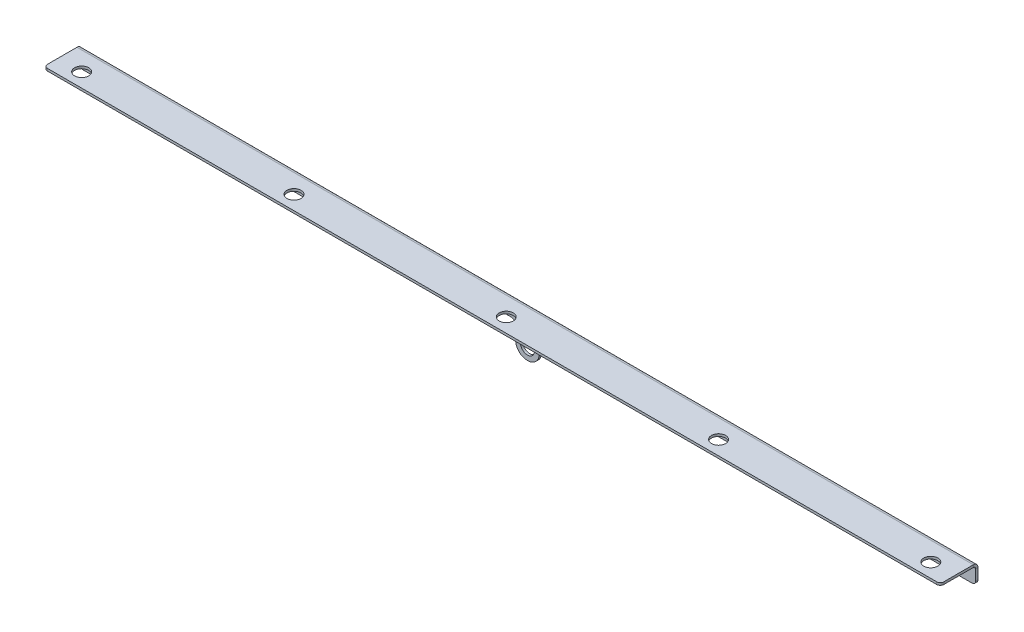
ISO-10303-21;
HEADER;
FILE_DESCRIPTION(('STEP AP214'),'2;1');
FILE_NAME('part.step','',(''),(''),'','','');
FILE_SCHEMA(('AUTOMOTIVE_DESIGN { 1 0 10303 214 1 1 1 1 }'));
ENDSEC;
DATA;
#1=APPLICATION_CONTEXT('core data for automotive mechanical design processes');
#2=APPLICATION_PROTOCOL_DEFINITION('international standard','automotive_design',2000,#1);
#3=PRODUCT_CONTEXT('',#1,'mechanical');
#4=PRODUCT('Part','Part','',(#3));
#5=PRODUCT_RELATED_PRODUCT_CATEGORY('part','',(#4));
#6=PRODUCT_DEFINITION_FORMATION('','',#4);
#7=PRODUCT_DEFINITION_CONTEXT('part definition',#1,'design');
#8=PRODUCT_DEFINITION('design','',#6,#7);
#9=PRODUCT_DEFINITION_SHAPE('','',#8);
#10=(LENGTH_UNIT() NAMED_UNIT(*) SI_UNIT(.MILLI.,.METRE.));
#11=(NAMED_UNIT(*) PLANE_ANGLE_UNIT() SI_UNIT($,.RADIAN.));
#12=(NAMED_UNIT(*) SI_UNIT($,.STERADIAN.) SOLID_ANGLE_UNIT());
#13=UNCERTAINTY_MEASURE_WITH_UNIT(LENGTH_MEASURE(1.E-05),#10,'distance_accuracy_value','');
#14=(GEOMETRIC_REPRESENTATION_CONTEXT(3) GLOBAL_UNCERTAINTY_ASSIGNED_CONTEXT((#13)) GLOBAL_UNIT_ASSIGNED_CONTEXT((#10,
#11,#12)) REPRESENTATION_CONTEXT('',''));
#15=CARTESIAN_POINT('',(0.,0.,0.));
#16=DIRECTION('',(0.,0.,1.));
#17=DIRECTION('',(1.,0.,0.));
#18=AXIS2_PLACEMENT_3D('',#15,#16,#17);
#19=CARTESIAN_POINT('',(378.5,7.00000000000004,14.5));
#20=DIRECTION('',(0.,-1.,0.));
#21=DIRECTION('',(0.,0.,-1.));
#22=AXIS2_PLACEMENT_3D('',#19,#20,#21);
#23=CYLINDRICAL_SURFACE('',#22,1.5);
#24=DIRECTION('',(0.,-1.,0.));
#25=VECTOR('',#24,1.);
#26=CARTESIAN_POINT('',(380.,7.00000000000002,14.5));
#27=LINE('',#26,#25);
#28=CARTESIAN_POINT('',(380.,8.00000000000005,14.5));
#29=VERTEX_POINT('',#28);
#30=CARTESIAN_POINT('',(380.,7.00000000000002,14.5));
#31=VERTEX_POINT('',#30);
#32=EDGE_CURVE('E11',#29,#31,#27,.T.);
#33=ORIENTED_EDGE('',*,*,#32,.F.);
#34=CARTESIAN_POINT('',(378.5,8.00000000000004,14.5));
#35=DIRECTION('',(0.,-1.,0.));
#36=DIRECTION('',(0.,0.,-1.));
#37=AXIS2_PLACEMENT_3D('',#34,#35,#36);
#38=CIRCLE('',#37,1.5);
#39=CARTESIAN_POINT('',(378.5,8.00000000000006,16.));
#40=VERTEX_POINT('',#39);
#41=EDGE_CURVE('E157',#40,#29,#38,.F.);
#42=ORIENTED_EDGE('',*,*,#41,.F.);
#43=DIRECTION('',(0.,-1.,0.));
#44=VECTOR('',#43,1.);
#45=CARTESIAN_POINT('',(378.5,7.00000000000005,16.));
#46=LINE('',#45,#44);
#47=CARTESIAN_POINT('',(378.5,7.00000000000005,16.));
#48=VERTEX_POINT('',#47);
#49=EDGE_CURVE('E46',#40,#48,#46,.T.);
#50=ORIENTED_EDGE('',*,*,#49,.T.);
#51=CARTESIAN_POINT('',(378.5,7.00000000000004,14.5));
#52=DIRECTION('',(0.,-1.,0.));
#53=DIRECTION('',(0.,0.,-1.));
#54=AXIS2_PLACEMENT_3D('',#51,#52,#53);
#55=CIRCLE('',#54,1.5);
#56=EDGE_CURVE('E282',#48,#31,#55,.F.);
#57=ORIENTED_EDGE('',*,*,#56,.T.);
#58=EDGE_LOOP('',(#33,#42,#50,#57));
#59=FACE_BOUND('',#58,.T.);
#60=ADVANCED_FACE('F36',(#59),#23,.T.);
#61=CARTESIAN_POINT('',(380.,7.00000000000005,16.));
#62=DIRECTION('',(0.,0.,-1.));
#63=DIRECTION('',(1.,0.,0.));
#64=AXIS2_PLACEMENT_3D('',#61,#62,#63);
#65=PLANE('',#64);
#66=ORIENTED_EDGE('',*,*,#49,.F.);
#67=DIRECTION('',(1.,0.,0.));
#68=VECTOR('',#67,1.);
#69=CARTESIAN_POINT('',(0.,8.00000000000006,16.));
#70=LINE('',#69,#68);
#71=CARTESIAN_POINT('',(1.5,8.00000000000006,16.));
#72=VERTEX_POINT('',#71);
#73=EDGE_CURVE('E212',#40,#72,#70,.F.);
#74=ORIENTED_EDGE('',*,*,#73,.T.);
#75=DIRECTION('',(0.,-1.,0.));
#76=VECTOR('',#75,1.);
#77=CARTESIAN_POINT('',(1.5,7.00000000000005,16.));
#78=LINE('',#77,#76);
#79=CARTESIAN_POINT('',(1.5,7.00000000000005,16.));
#80=VERTEX_POINT('',#79);
#81=EDGE_CURVE('E275',#72,#80,#78,.T.);
#82=ORIENTED_EDGE('',*,*,#81,.T.);
#83=DIRECTION('',(1.,0.,0.));
#84=VECTOR('',#83,1.);
#85=CARTESIAN_POINT('',(380.,7.00000000000005,16.));
#86=LINE('',#85,#84);
#87=EDGE_CURVE('E292',#48,#80,#86,.F.);
#88=ORIENTED_EDGE('',*,*,#87,.F.);
#89=EDGE_LOOP('',(#66,#74,#82,#88));
#90=FACE_BOUND('',#89,.T.);
#91=ADVANCED_FACE('F295',(#90),#65,.F.);
#92=CARTESIAN_POINT('',(1.5,7.00000000000005,14.5));
#93=DIRECTION('',(0.,-1.,0.));
#94=DIRECTION('',(0.,0.,-1.));
#95=AXIS2_PLACEMENT_3D('',#92,#93,#94);
#96=CYLINDRICAL_SURFACE('',#95,1.5);
#97=ORIENTED_EDGE('',*,*,#81,.F.);
#98=CARTESIAN_POINT('',(1.5,8.00000000000005,14.5));
#99=DIRECTION('',(0.,-1.,0.));
#100=DIRECTION('',(0.,0.,-1.));
#101=AXIS2_PLACEMENT_3D('',#98,#99,#100);
#102=CIRCLE('',#101,1.5);
#103=CARTESIAN_POINT('',(0.,8.00000000000005,14.5));
#104=VERTEX_POINT('',#103);
#105=EDGE_CURVE('E209',#104,#72,#102,.F.);
#106=ORIENTED_EDGE('',*,*,#105,.F.);
#107=DIRECTION('',(0.,-1.,0.));
#108=VECTOR('',#107,1.);
#109=CARTESIAN_POINT('',(0.,7.00000000000005,14.5));
#110=LINE('',#109,#108);
#111=CARTESIAN_POINT('',(0.,7.00000000000005,14.5));
#112=VERTEX_POINT('',#111);
#113=EDGE_CURVE('E272',#104,#112,#110,.T.);
#114=ORIENTED_EDGE('',*,*,#113,.T.);
#115=CARTESIAN_POINT('',(1.5,7.00000000000005,14.5));
#116=DIRECTION('',(0.,-1.,0.));
#117=DIRECTION('',(0.,0.,-1.));
#118=AXIS2_PLACEMENT_3D('',#115,#116,#117);
#119=CIRCLE('',#118,1.5);
#120=EDGE_CURVE('E296',#112,#80,#119,.F.);
#121=ORIENTED_EDGE('',*,*,#120,.T.);
#122=EDGE_LOOP('',(#97,#106,#114,#121));
#123=FACE_BOUND('',#122,.T.);
#124=ADVANCED_FACE('F488',(#123),#96,.T.);
#125=CARTESIAN_POINT('',(0.,7.00000000000005,16.));
#126=DIRECTION('',(-1.,0.,0.));
#127=DIRECTION('',(0.,0.,-1.));
#128=AXIS2_PLACEMENT_3D('',#125,#126,#127);
#129=PLANE('',#128);
#130=ORIENTED_EDGE('',*,*,#113,.F.);
#131=DIRECTION('',(0.,0.,-1.));
#132=VECTOR('',#131,1.);
#133=CARTESIAN_POINT('',(0.,8.,0.));
#134=LINE('',#133,#132);
#135=CARTESIAN_POINT('',(0.,8.00000000000001,2.));
#136=VERTEX_POINT('',#135);
#137=EDGE_CURVE('E153',#104,#136,#134,.T.);
#138=ORIENTED_EDGE('',*,*,#137,.T.);
#139=DIRECTION('',(0.,-1.,0.));
#140=VECTOR('',#139,1.);
#141=CARTESIAN_POINT('',(0.,7.00000000000002,2.));
#142=LINE('',#141,#140);
#143=CARTESIAN_POINT('',(0.,7.00000000000002,2.));
#144=VERTEX_POINT('',#143);
#145=EDGE_CURVE('E269',#136,#144,#142,.T.);
#146=ORIENTED_EDGE('',*,*,#145,.T.);
#147=DIRECTION('',(0.,0.,-1.));
#148=VECTOR('',#147,1.);
#149=CARTESIAN_POINT('',(0.,7.00000000000005,16.));
#150=LINE('',#149,#148);
#151=EDGE_CURVE('E431',#112,#144,#150,.T.);
#152=ORIENTED_EDGE('',*,*,#151,.F.);
#153=EDGE_LOOP('',(#130,#138,#146,#152));
#154=FACE_BOUND('',#153,.T.);
#155=ADVANCED_FACE('F430',(#154),#129,.T.);
#156=CARTESIAN_POINT('',(0.,6.,2.));
#157=DIRECTION('',(1.,0.,0.));
#158=DIRECTION('',(0.,0.,-1.));
#159=AXIS2_PLACEMENT_3D('',#156,#157,#158);
#160=PLANE('',#159);
#161=ORIENTED_EDGE('',*,*,#145,.F.);
#162=CARTESIAN_POINT('',(0.,6.,2.));
#163=DIRECTION('',(-1.,0.,0.));
#164=DIRECTION('',(0.,0.,1.));
#165=AXIS2_PLACEMENT_3D('',#162,#163,#164);
#166=CIRCLE('',#165,2.);
#167=CARTESIAN_POINT('',(0.,6.,0.));
#168=VERTEX_POINT('',#167);
#169=EDGE_CURVE('E149',#136,#168,#166,.T.);
#170=ORIENTED_EDGE('',*,*,#169,.T.);
#171=DIRECTION('',(0.,0.,1.));
#172=VECTOR('',#171,1.);
#173=CARTESIAN_POINT('',(0.,6.,1.));
#174=LINE('',#173,#172);
#175=CARTESIAN_POINT('',(0.,6.,1.));
#176=VERTEX_POINT('',#175);
#177=EDGE_CURVE('E266',#168,#176,#174,.T.);
#178=ORIENTED_EDGE('',*,*,#177,.T.);
#179=CARTESIAN_POINT('',(0.,6.,2.));
#180=DIRECTION('',(-1.,0.,0.));
#181=DIRECTION('',(0.,0.,1.));
#182=AXIS2_PLACEMENT_3D('',#179,#180,#181);
#183=CIRCLE('',#182,1.);
#184=EDGE_CURVE('E138',#144,#176,#183,.T.);
#185=ORIENTED_EDGE('',*,*,#184,.F.);
#186=EDGE_LOOP('',(#161,#170,#178,#185));
#187=FACE_BOUND('',#186,.T.);
#188=ADVANCED_FACE('F427',(#187),#160,.F.);
#189=CARTESIAN_POINT('',(0.,0.,1.));
#190=DIRECTION('',(-1.,0.,0.));
#191=DIRECTION('',(0.,1.,0.));
#192=AXIS2_PLACEMENT_3D('',#189,#190,#191);
#193=PLANE('',#192);
#194=ORIENTED_EDGE('',*,*,#177,.F.);
#195=DIRECTION('',(0.,1.,0.));
#196=VECTOR('',#195,1.);
#197=CARTESIAN_POINT('',(0.,0.,0.));
#198=LINE('',#197,#196);
#199=CARTESIAN_POINT('',(0.,1.5,0.));
#200=VERTEX_POINT('',#199);
#201=EDGE_CURVE('E204',#168,#200,#198,.F.);
#202=ORIENTED_EDGE('',*,*,#201,.T.);
#203=DIRECTION('',(0.,0.,1.));
#204=VECTOR('',#203,1.);
#205=CARTESIAN_POINT('',(0.,1.5,1.));
#206=LINE('',#205,#204);
#207=CARTESIAN_POINT('',(0.,1.5,1.));
#208=VERTEX_POINT('',#207);
#209=EDGE_CURVE('E263',#200,#208,#206,.T.);
#210=ORIENTED_EDGE('',*,*,#209,.T.);
#211=DIRECTION('',(0.,1.,0.));
#212=VECTOR('',#211,1.);
#213=CARTESIAN_POINT('',(0.,0.,1.));
#214=LINE('',#213,#212);
#215=EDGE_CURVE('E325',#176,#208,#214,.F.);
#216=ORIENTED_EDGE('',*,*,#215,.F.);
#217=EDGE_LOOP('',(#194,#202,#210,#216));
#218=FACE_BOUND('',#217,.T.);
#219=ADVANCED_FACE('F554',(#218),#193,.T.);
#220=CARTESIAN_POINT('',(1.5,1.5,1.));
#221=DIRECTION('',(0.,0.,1.));
#222=DIRECTION('',(1.,0.,0.));
#223=AXIS2_PLACEMENT_3D('',#220,#221,#222);
#224=CYLINDRICAL_SURFACE('',#223,1.5);
#225=ORIENTED_EDGE('',*,*,#209,.F.);
#226=CARTESIAN_POINT('',(1.5,1.5,0.));
#227=DIRECTION('',(0.,0.,1.));
#228=DIRECTION('',(1.,0.,0.));
#229=AXIS2_PLACEMENT_3D('',#226,#227,#228);
#230=CIRCLE('',#229,1.5);
#231=CARTESIAN_POINT('',(1.5,0.,0.));
#232=VERTEX_POINT('',#231);
#233=EDGE_CURVE('E201',#232,#200,#230,.F.);
#234=ORIENTED_EDGE('',*,*,#233,.F.);
#235=DIRECTION('',(0.,0.,1.));
#236=VECTOR('',#235,1.);
#237=CARTESIAN_POINT('',(1.5,0.,1.));
#238=LINE('',#237,#236);
#239=CARTESIAN_POINT('',(1.5,0.,1.));
#240=VERTEX_POINT('',#239);
#241=EDGE_CURVE('E260',#232,#240,#238,.T.);
#242=ORIENTED_EDGE('',*,*,#241,.T.);
#243=CARTESIAN_POINT('',(1.5,1.5,1.));
#244=DIRECTION('',(0.,0.,1.));
#245=DIRECTION('',(1.,0.,0.));
#246=AXIS2_PLACEMENT_3D('',#243,#244,#245);
#247=CIRCLE('',#246,1.5);
#248=EDGE_CURVE('E328',#240,#208,#247,.F.);
#249=ORIENTED_EDGE('',*,*,#248,.T.);
#250=EDGE_LOOP('',(#225,#234,#242,#249));
#251=FACE_BOUND('',#250,.T.);
#252=ADVANCED_FACE('F550',(#251),#224,.T.);
#253=CARTESIAN_POINT('',(0.,0.,1.));
#254=DIRECTION('',(0.,1.,0.));
#255=DIRECTION('',(1.,0.,0.));
#256=AXIS2_PLACEMENT_3D('',#253,#254,#255);
#257=PLANE('',#256);
#258=ORIENTED_EDGE('',*,*,#241,.F.);
#259=DIRECTION('',(-1.,0.,0.));
#260=VECTOR('',#259,1.);
#261=CARTESIAN_POINT('',(0.,0.,0.));
#262=LINE('',#261,#260);
#263=CARTESIAN_POINT('',(183.,0.,0.));
#264=VERTEX_POINT('',#263);
#265=EDGE_CURVE('E198',#232,#264,#262,.F.);
#266=ORIENTED_EDGE('',*,*,#265,.T.);
#267=DIRECTION('',(0.,0.,1.));
#268=VECTOR('',#267,1.);
#269=CARTESIAN_POINT('',(183.,0.,1.));
#270=LINE('',#269,#268);
#271=CARTESIAN_POINT('',(183.,0.,1.));
#272=VERTEX_POINT('',#271);
#273=EDGE_CURVE('E257',#264,#272,#270,.T.);
#274=ORIENTED_EDGE('',*,*,#273,.T.);
#275=DIRECTION('',(1.,0.,0.));
#276=VECTOR('',#275,1.);
#277=CARTESIAN_POINT('',(0.,0.,1.));
#278=LINE('',#277,#276);
#279=EDGE_CURVE('E331',#240,#272,#278,.T.);
#280=ORIENTED_EDGE('',*,*,#279,.F.);
#281=EDGE_LOOP('',(#258,#266,#274,#280));
#282=FACE_BOUND('',#281,.T.);
#283=ADVANCED_FACE('F546',(#282),#257,.F.);
#284=CARTESIAN_POINT('',(183.,-2.,1.));
#285=DIRECTION('',(0.,0.,1.));
#286=DIRECTION('',(1.,0.,0.));
#287=AXIS2_PLACEMENT_3D('',#284,#285,#286);
#288=CYLINDRICAL_SURFACE('',#287,2.);
#289=ORIENTED_EDGE('',*,*,#273,.F.);
#290=CARTESIAN_POINT('',(183.,-2.,0.));
#291=DIRECTION('',(0.,0.,1.));
#292=DIRECTION('',(1.,0.,0.));
#293=AXIS2_PLACEMENT_3D('',#290,#291,#292);
#294=CIRCLE('',#293,2.);
#295=CARTESIAN_POINT('',(185.,-2.,0.));
#296=VERTEX_POINT('',#295);
#297=EDGE_CURVE('E195',#264,#296,#294,.F.);
#298=ORIENTED_EDGE('',*,*,#297,.T.);
#299=DIRECTION('',(0.,0.,1.));
#300=VECTOR('',#299,1.);
#301=CARTESIAN_POINT('',(185.,-2.,1.));
#302=LINE('',#301,#300);
#303=CARTESIAN_POINT('',(185.,-2.,1.));
#304=VERTEX_POINT('',#303);
#305=EDGE_CURVE('E254',#296,#304,#302,.T.);
#306=ORIENTED_EDGE('',*,*,#305,.T.);
#307=CARTESIAN_POINT('',(183.,-2.,1.));
#308=DIRECTION('',(0.,0.,1.));
#309=DIRECTION('',(1.,0.,0.));
#310=AXIS2_PLACEMENT_3D('',#307,#308,#309);
#311=CIRCLE('',#310,2.);
#312=EDGE_CURVE('E334',#272,#304,#311,.F.);
#313=ORIENTED_EDGE('',*,*,#312,.F.);
#314=EDGE_LOOP('',(#289,#298,#306,#313));
#315=FACE_BOUND('',#314,.T.);
#316=ADVANCED_FACE('F543',(#315),#288,.F.);
#317=CARTESIAN_POINT('',(185.,-12.5,1.));
#318=DIRECTION('',(-1.,0.,0.));
#319=DIRECTION('',(0.,1.,0.));
#320=AXIS2_PLACEMENT_3D('',#317,#318,#319);
#321=PLANE('',#320);
#322=ORIENTED_EDGE('',*,*,#305,.F.);
#323=DIRECTION('',(0.,1.,0.));
#324=VECTOR('',#323,1.);
#325=CARTESIAN_POINT('',(185.,0.,0.));
#326=LINE('',#325,#324);
#327=CARTESIAN_POINT('',(185.,-7.6,0.));
#328=VERTEX_POINT('',#327);
#329=EDGE_CURVE('E192',#296,#328,#326,.F.);
#330=ORIENTED_EDGE('',*,*,#329,.T.);
#331=DIRECTION('',(0.,0.,1.));
#332=VECTOR('',#331,1.);
#333=CARTESIAN_POINT('',(185.,-7.6,1.));
#334=LINE('',#333,#332);
#335=CARTESIAN_POINT('',(185.,-7.6,1.));
#336=VERTEX_POINT('',#335);
#337=EDGE_CURVE('E251',#328,#336,#334,.T.);
#338=ORIENTED_EDGE('',*,*,#337,.T.);
#339=DIRECTION('',(0.,1.,0.));
#340=VECTOR('',#339,1.);
#341=CARTESIAN_POINT('',(185.,-12.5,1.));
#342=LINE('',#341,#340);
#343=EDGE_CURVE('E337',#304,#336,#342,.F.);
#344=ORIENTED_EDGE('',*,*,#343,.F.);
#345=EDGE_LOOP('',(#322,#330,#338,#344));
#346=FACE_BOUND('',#345,.T.);
#347=ADVANCED_FACE('F393',(#346),#321,.T.);
#348=CARTESIAN_POINT('',(189.9,-7.6,1.));
#349=DIRECTION('',(0.,0.,1.));
#350=DIRECTION('',(1.,0.,0.));
#351=AXIS2_PLACEMENT_3D('',#348,#349,#350);
#352=CYLINDRICAL_SURFACE('',#351,4.89999999999999);
#353=ORIENTED_EDGE('',*,*,#337,.F.);
#354=CARTESIAN_POINT('',(189.9,-7.6,0.));
#355=DIRECTION('',(0.,0.,1.));
#356=DIRECTION('',(1.,0.,0.));
#357=AXIS2_PLACEMENT_3D('',#354,#355,#356);
#358=CIRCLE('',#357,4.89999999999999);
#359=CARTESIAN_POINT('',(189.9,-12.5,0.));
#360=VERTEX_POINT('',#359);
#361=EDGE_CURVE('E167',#360,#328,#358,.F.);
#362=ORIENTED_EDGE('',*,*,#361,.F.);
#363=DIRECTION('',(0.,0.,1.));
#364=VECTOR('',#363,1.);
#365=CARTESIAN_POINT('',(189.9,-12.5,1.));
#366=LINE('',#365,#364);
#367=CARTESIAN_POINT('',(189.9,-12.5,1.));
#368=VERTEX_POINT('',#367);
#369=EDGE_CURVE('E249',#360,#368,#366,.T.);
#370=ORIENTED_EDGE('',*,*,#369,.T.);
#371=CARTESIAN_POINT('',(189.9,-7.6,1.));
#372=DIRECTION('',(0.,0.,1.));
#373=DIRECTION('',(1.,0.,0.));
#374=AXIS2_PLACEMENT_3D('',#371,#372,#373);
#375=CIRCLE('',#374,4.89999999999999);
#376=EDGE_CURVE('E340',#368,#336,#375,.F.);
#377=ORIENTED_EDGE('',*,*,#376,.T.);
#378=EDGE_LOOP('',(#353,#362,#370,#377));
#379=FACE_BOUND('',#378,.T.);
#380=ADVANCED_FACE('F399',(#379),#352,.T.);
#381=CARTESIAN_POINT('',(0.,-12.5,1.));
#382=DIRECTION('',(0.,1.,0.));
#383=DIRECTION('',(1.,0.,0.));
#384=AXIS2_PLACEMENT_3D('',#381,#382,#383);
#385=PLANE('',#384);
#386=ORIENTED_EDGE('',*,*,#369,.F.);
#387=DIRECTION('',(-1.,0.,0.));
#388=VECTOR('',#387,1.);
#389=CARTESIAN_POINT('',(0.,-12.5,0.));
#390=LINE('',#389,#388);
#391=CARTESIAN_POINT('',(190.1,-12.5,0.));
#392=VERTEX_POINT('',#391);
#393=EDGE_CURVE('E162',#392,#360,#390,.T.);
#394=ORIENTED_EDGE('',*,*,#393,.F.);
#395=DIRECTION('',(0.,0.,1.));
#396=VECTOR('',#395,1.);
#397=CARTESIAN_POINT('',(190.1,-12.5,1.));
#398=LINE('',#397,#396);
#399=CARTESIAN_POINT('',(190.1,-12.5,1.));
#400=VERTEX_POINT('',#399);
#401=EDGE_CURVE('E54',#392,#400,#398,.T.);
#402=ORIENTED_EDGE('',*,*,#401,.T.);
#403=DIRECTION('',(1.,0.,0.));
#404=VECTOR('',#403,1.);
#405=CARTESIAN_POINT('',(0.,-12.5,1.));
#406=LINE('',#405,#404);
#407=EDGE_CURVE('E343',#400,#368,#406,.F.);
#408=ORIENTED_EDGE('',*,*,#407,.T.);
#409=EDGE_LOOP('',(#386,#394,#402,#408));
#410=FACE_BOUND('',#409,.T.);
#411=ADVANCED_FACE('F400',(#410),#385,.F.);
#412=CARTESIAN_POINT('',(190.1,-7.6,1.));
#413=DIRECTION('',(0.,0.,-1.));
#414=DIRECTION('',(-1.,0.,0.));
#415=AXIS2_PLACEMENT_3D('',#412,#413,#414);
#416=CYLINDRICAL_SURFACE('',#415,4.89999999999999);
#417=ORIENTED_EDGE('',*,*,#401,.F.);
#418=CARTESIAN_POINT('',(190.1,-7.6,0.));
#419=DIRECTION('',(0.,0.,-1.));
#420=DIRECTION('',(-1.,0.,0.));
#421=AXIS2_PLACEMENT_3D('',#418,#419,#420);
#422=CIRCLE('',#421,4.89999999999999);
#423=CARTESIAN_POINT('',(195.,-7.6,0.));
#424=VERTEX_POINT('',#423);
#425=EDGE_CURVE('E186',#424,#392,#422,.T.);
#426=ORIENTED_EDGE('',*,*,#425,.F.);
#427=DIRECTION('',(0.,0.,1.));
#428=VECTOR('',#427,1.);
#429=CARTESIAN_POINT('',(195.,-7.6,1.));
#430=LINE('',#429,#428);
#431=CARTESIAN_POINT('',(195.,-7.6,1.));
#432=VERTEX_POINT('',#431);
#433=EDGE_CURVE('E245',#424,#432,#430,.T.);
#434=ORIENTED_EDGE('',*,*,#433,.T.);
#435=CARTESIAN_POINT('',(190.1,-7.6,1.));
#436=DIRECTION('',(0.,0.,-1.));
#437=DIRECTION('',(-1.,0.,0.));
#438=AXIS2_PLACEMENT_3D('',#435,#436,#437);
#439=CIRCLE('',#438,4.89999999999999);
#440=EDGE_CURVE('E304',#432,#400,#439,.T.);
#441=ORIENTED_EDGE('',*,*,#440,.T.);
#442=EDGE_LOOP('',(#417,#426,#434,#441));
#443=FACE_BOUND('',#442,.T.);
#444=ADVANCED_FACE('F407',(#443),#416,.T.);
#445=CARTESIAN_POINT('',(195.,-12.5,1.));
#446=DIRECTION('',(-1.,0.,0.));
#447=DIRECTION('',(0.,1.,0.));
#448=AXIS2_PLACEMENT_3D('',#445,#446,#447);
#449=PLANE('',#448);
#450=ORIENTED_EDGE('',*,*,#433,.F.);
#451=DIRECTION('',(0.,1.,0.));
#452=VECTOR('',#451,1.);
#453=CARTESIAN_POINT('',(195.,0.,0.));
#454=LINE('',#453,#452);
#455=CARTESIAN_POINT('',(195.,-2.,0.));
#456=VERTEX_POINT('',#455);
#457=EDGE_CURVE('E183',#424,#456,#454,.T.);
#458=ORIENTED_EDGE('',*,*,#457,.T.);
#459=DIRECTION('',(0.,0.,1.));
#460=VECTOR('',#459,1.);
#461=CARTESIAN_POINT('',(195.,-2.,1.));
#462=LINE('',#461,#460);
#463=CARTESIAN_POINT('',(195.,-2.,1.));
#464=VERTEX_POINT('',#463);
#465=EDGE_CURVE('E242',#456,#464,#462,.T.);
#466=ORIENTED_EDGE('',*,*,#465,.T.);
#467=DIRECTION('',(0.,1.,0.));
#468=VECTOR('',#467,1.);
#469=CARTESIAN_POINT('',(195.,-12.5,1.));
#470=LINE('',#469,#468);
#471=EDGE_CURVE('E307',#432,#464,#470,.T.);
#472=ORIENTED_EDGE('',*,*,#471,.F.);
#473=EDGE_LOOP('',(#450,#458,#466,#472));
#474=FACE_BOUND('',#473,.T.);
#475=ADVANCED_FACE('F411',(#474),#449,.F.);
#476=CARTESIAN_POINT('',(197.,-2.,1.));
#477=DIRECTION('',(0.,0.,-1.));
#478=DIRECTION('',(-1.,0.,0.));
#479=AXIS2_PLACEMENT_3D('',#476,#477,#478);
#480=CYLINDRICAL_SURFACE('',#479,2.);
#481=ORIENTED_EDGE('',*,*,#465,.F.);
#482=CARTESIAN_POINT('',(197.,-2.,0.));
#483=DIRECTION('',(0.,0.,-1.));
#484=DIRECTION('',(-1.,0.,0.));
#485=AXIS2_PLACEMENT_3D('',#482,#483,#484);
#486=CIRCLE('',#485,2.);
#487=CARTESIAN_POINT('',(197.,0.,0.));
#488=VERTEX_POINT('',#487);
#489=EDGE_CURVE('E180',#456,#488,#486,.T.);
#490=ORIENTED_EDGE('',*,*,#489,.T.);
#491=DIRECTION('',(0.,0.,1.));
#492=VECTOR('',#491,1.);
#493=CARTESIAN_POINT('',(197.,0.,1.));
#494=LINE('',#493,#492);
#495=CARTESIAN_POINT('',(197.,0.,1.));
#496=VERTEX_POINT('',#495);
#497=EDGE_CURVE('E239',#488,#496,#494,.T.);
#498=ORIENTED_EDGE('',*,*,#497,.T.);
#499=CARTESIAN_POINT('',(197.,-2.,1.));
#500=DIRECTION('',(0.,0.,-1.));
#501=DIRECTION('',(-1.,0.,0.));
#502=AXIS2_PLACEMENT_3D('',#499,#500,#501);
#503=CIRCLE('',#502,2.);
#504=EDGE_CURVE('E310',#464,#496,#503,.T.);
#505=ORIENTED_EDGE('',*,*,#504,.F.);
#506=EDGE_LOOP('',(#481,#490,#498,#505));
#507=FACE_BOUND('',#506,.T.);
#508=ADVANCED_FACE('F413',(#507),#480,.F.);
#509=CARTESIAN_POINT('',(0.,0.,1.));
#510=DIRECTION('',(0.,1.,0.));
#511=DIRECTION('',(1.,0.,0.));
#512=AXIS2_PLACEMENT_3D('',#509,#510,#511);
#513=PLANE('',#512);
#514=ORIENTED_EDGE('',*,*,#497,.F.);
#515=DIRECTION('',(-1.,0.,0.));
#516=VECTOR('',#515,1.);
#517=CARTESIAN_POINT('',(0.,0.,0.));
#518=LINE('',#517,#516);
#519=CARTESIAN_POINT('',(378.5,0.,0.));
#520=VERTEX_POINT('',#519);
#521=EDGE_CURVE('E177',#488,#520,#518,.F.);
#522=ORIENTED_EDGE('',*,*,#521,.T.);
#523=DIRECTION('',(0.,0.,1.));
#524=VECTOR('',#523,1.);
#525=CARTESIAN_POINT('',(378.5,0.,1.));
#526=LINE('',#525,#524);
#527=CARTESIAN_POINT('',(378.5,0.,1.));
#528=VERTEX_POINT('',#527);
#529=EDGE_CURVE('E236',#520,#528,#526,.T.);
#530=ORIENTED_EDGE('',*,*,#529,.T.);
#531=DIRECTION('',(1.,0.,0.));
#532=VECTOR('',#531,1.);
#533=CARTESIAN_POINT('',(0.,0.,1.));
#534=LINE('',#533,#532);
#535=EDGE_CURVE('E313',#496,#528,#534,.T.);
#536=ORIENTED_EDGE('',*,*,#535,.F.);
#537=EDGE_LOOP('',(#514,#522,#530,#536));
#538=FACE_BOUND('',#537,.T.);
#539=ADVANCED_FACE('F418',(#538),#513,.F.);
#540=CARTESIAN_POINT('',(378.5,1.5,1.));
#541=DIRECTION('',(0.,0.,1.));
#542=DIRECTION('',(1.,0.,0.));
#543=AXIS2_PLACEMENT_3D('',#540,#541,#542);
#544=CYLINDRICAL_SURFACE('',#543,1.5);
#545=ORIENTED_EDGE('',*,*,#529,.F.);
#546=CARTESIAN_POINT('',(378.5,1.5,0.));
#547=DIRECTION('',(0.,0.,1.));
#548=DIRECTION('',(1.,0.,0.));
#549=AXIS2_PLACEMENT_3D('',#546,#547,#548);
#550=CIRCLE('',#549,1.5);
#551=CARTESIAN_POINT('',(380.,1.5,0.));
#552=VERTEX_POINT('',#551);
#553=EDGE_CURVE('E174',#552,#520,#550,.F.);
#554=ORIENTED_EDGE('',*,*,#553,.F.);
#555=DIRECTION('',(0.,0.,1.));
#556=VECTOR('',#555,1.);
#557=CARTESIAN_POINT('',(380.,1.5,1.));
#558=LINE('',#557,#556);
#559=CARTESIAN_POINT('',(380.,1.5,1.));
#560=VERTEX_POINT('',#559);
#561=EDGE_CURVE('E233',#552,#560,#558,.T.);
#562=ORIENTED_EDGE('',*,*,#561,.T.);
#563=CARTESIAN_POINT('',(378.5,1.5,1.));
#564=DIRECTION('',(0.,0.,1.));
#565=DIRECTION('',(1.,0.,0.));
#566=AXIS2_PLACEMENT_3D('',#563,#564,#565);
#567=CIRCLE('',#566,1.5);
#568=EDGE_CURVE('E316',#560,#528,#567,.F.);
#569=ORIENTED_EDGE('',*,*,#568,.T.);
#570=EDGE_LOOP('',(#545,#554,#562,#569));
#571=FACE_BOUND('',#570,.T.);
#572=ADVANCED_FACE('F421',(#571),#544,.T.);
#573=CARTESIAN_POINT('',(380.,0.,1.));
#574=DIRECTION('',(-1.,0.,0.));
#575=DIRECTION('',(0.,1.,0.));
#576=AXIS2_PLACEMENT_3D('',#573,#574,#575);
#577=PLANE('',#576);
#578=ORIENTED_EDGE('',*,*,#561,.F.);
#579=DIRECTION('',(0.,1.,0.));
#580=VECTOR('',#579,1.);
#581=CARTESIAN_POINT('',(380.,0.,0.));
#582=LINE('',#581,#580);
#583=CARTESIAN_POINT('',(380.,6.,0.));
#584=VERTEX_POINT('',#583);
#585=EDGE_CURVE('E172',#552,#584,#582,.T.);
#586=ORIENTED_EDGE('',*,*,#585,.T.);
#587=DIRECTION('',(0.,0.,1.));
#588=VECTOR('',#587,1.);
#589=CARTESIAN_POINT('',(380.,6.,1.));
#590=LINE('',#589,#588);
#591=CARTESIAN_POINT('',(380.,6.,1.));
#592=VERTEX_POINT('',#591);
#593=EDGE_CURVE('E137',#584,#592,#590,.T.);
#594=ORIENTED_EDGE('',*,*,#593,.T.);
#595=DIRECTION('',(0.,1.,0.));
#596=VECTOR('',#595,1.);
#597=CARTESIAN_POINT('',(380.,0.,1.));
#598=LINE('',#597,#596);
#599=EDGE_CURVE('E319',#560,#592,#598,.T.);
#600=ORIENTED_EDGE('',*,*,#599,.F.);
#601=EDGE_LOOP('',(#578,#586,#594,#600));
#602=FACE_BOUND('',#601,.T.);
#603=ADVANCED_FACE('F422',(#602),#577,.F.);
#604=CARTESIAN_POINT('',(380.,6.,2.));
#605=DIRECTION('',(1.,0.,0.));
#606=DIRECTION('',(0.,0.,-1.));
#607=AXIS2_PLACEMENT_3D('',#604,#605,#606);
#608=PLANE('',#607);
#609=ORIENTED_EDGE('',*,*,#593,.F.);
#610=CARTESIAN_POINT('',(380.,6.,2.));
#611=DIRECTION('',(-1.,0.,0.));
#612=DIRECTION('',(0.,0.,1.));
#613=AXIS2_PLACEMENT_3D('',#610,#611,#612);
#614=CIRCLE('',#613,2.);
#615=CARTESIAN_POINT('',(380.,8.00000000000001,1.99999999999999));
#616=VERTEX_POINT('',#615);
#617=EDGE_CURVE('E146',#616,#584,#614,.T.);
#618=ORIENTED_EDGE('',*,*,#617,.F.);
#619=DIRECTION('',(0.,-1.,0.));
#620=VECTOR('',#619,1.);
#621=CARTESIAN_POINT('',(380.,7.,1.99999999999999));
#622=LINE('',#621,#620);
#623=CARTESIAN_POINT('',(380.,7.,1.99999999999999));
#624=VERTEX_POINT('',#623);
#625=EDGE_CURVE('E40',#616,#624,#622,.T.);
#626=ORIENTED_EDGE('',*,*,#625,.T.);
#627=CARTESIAN_POINT('',(380.,6.,2.));
#628=DIRECTION('',(-1.,0.,0.));
#629=DIRECTION('',(0.,0.,1.));
#630=AXIS2_PLACEMENT_3D('',#627,#628,#629);
#631=CIRCLE('',#630,1.);
#632=EDGE_CURVE('E345',#624,#592,#631,.T.);
#633=ORIENTED_EDGE('',*,*,#632,.T.);
#634=EDGE_LOOP('',(#609,#618,#626,#633));
#635=FACE_BOUND('',#634,.T.);
#636=ADVANCED_FACE('F159',(#635),#608,.T.);
#637=CARTESIAN_POINT('',(190.,7.00000000000003,10.));
#638=DIRECTION('',(0.,1.,0.));
#639=DIRECTION('',(0.,0.,1.));
#640=AXIS2_PLACEMENT_3D('',#637,#638,#639);
#641=CYLINDRICAL_SURFACE('',#640,2.99999999999999);
#642=CARTESIAN_POINT('',(190.,7.00000000000003,10.));
#643=DIRECTION('',(0.,1.,0.));
#644=DIRECTION('',(0.,0.,1.));
#645=AXIS2_PLACEMENT_3D('',#642,#643,#644);
#646=CIRCLE('',#645,2.99999999999999);
#647=CARTESIAN_POINT('',(190.,7.00000000000004,13.));
#648=VERTEX_POINT('',#647);
#649=EDGE_CURVE('E164',#648,#648,#646,.T.);
#650=ORIENTED_EDGE('',*,*,#649,.F.);
#651=EDGE_LOOP('',(#650));
#652=FACE_BOUND('',#651,.T.);
#653=CARTESIAN_POINT('',(190.,8.00000000000003,10.));
#654=DIRECTION('',(0.,1.,0.));
#655=DIRECTION('',(0.,0.,1.));
#656=AXIS2_PLACEMENT_3D('',#653,#654,#655);
#657=CIRCLE('',#656,2.99999999999999);
#658=CARTESIAN_POINT('',(190.,8.00000000000004,13.));
#659=VERTEX_POINT('',#658);
#660=EDGE_CURVE('E218',#659,#659,#657,.T.);
#661=ORIENTED_EDGE('',*,*,#660,.T.);
#662=EDGE_LOOP('',(#661));
#663=FACE_BOUND('',#662,.T.);
#664=ADVANCED_FACE('F452',(#652,#663),#641,.F.);
#665=CARTESIAN_POINT('',(10.,7.00000000000003,10.));
#666=DIRECTION('',(0.,1.,0.));
#667=DIRECTION('',(0.,0.,1.));
#668=AXIS2_PLACEMENT_3D('',#665,#666,#667);
#669=CYLINDRICAL_SURFACE('',#668,3.);
#670=CARTESIAN_POINT('',(10.,7.00000000000003,10.));
#671=DIRECTION('',(0.,1.,0.));
#672=DIRECTION('',(0.,0.,1.));
#673=AXIS2_PLACEMENT_3D('',#670,#671,#672);
#674=CIRCLE('',#673,3.);
#675=CARTESIAN_POINT('',(10.,7.00000000000004,13.));
#676=VERTEX_POINT('',#675);
#677=EDGE_CURVE('E444',#676,#676,#674,.T.);
#678=ORIENTED_EDGE('',*,*,#677,.F.);
#679=EDGE_LOOP('',(#678));
#680=FACE_BOUND('',#679,.T.);
#681=CARTESIAN_POINT('',(10.,8.00000000000003,10.));
#682=DIRECTION('',(0.,1.,0.));
#683=DIRECTION('',(0.,0.,1.));
#684=AXIS2_PLACEMENT_3D('',#681,#682,#683);
#685=CIRCLE('',#684,3.);
#686=CARTESIAN_POINT('',(10.,8.00000000000004,13.));
#687=VERTEX_POINT('',#686);
#688=EDGE_CURVE('E221',#687,#687,#685,.T.);
#689=ORIENTED_EDGE('',*,*,#688,.T.);
#690=EDGE_LOOP('',(#689));
#691=FACE_BOUND('',#690,.T.);
#692=ADVANCED_FACE('F455',(#680,#691),#669,.F.);
#693=CARTESIAN_POINT('',(100.,7.00000000000003,10.));
#694=DIRECTION('',(0.,1.,0.));
#695=DIRECTION('',(0.,0.,1.));
#696=AXIS2_PLACEMENT_3D('',#693,#694,#695);
#697=CYLINDRICAL_SURFACE('',#696,3.00000000000001);
#698=CARTESIAN_POINT('',(100.,7.00000000000003,10.));
#699=DIRECTION('',(0.,1.,0.));
#700=DIRECTION('',(0.,0.,1.));
#701=AXIS2_PLACEMENT_3D('',#698,#699,#700);
#702=CIRCLE('',#701,3.00000000000001);
#703=CARTESIAN_POINT('',(100.,7.00000000000004,13.));
#704=VERTEX_POINT('',#703);
#705=EDGE_CURVE('E441',#704,#704,#702,.T.);
#706=ORIENTED_EDGE('',*,*,#705,.F.);
#707=EDGE_LOOP('',(#706));
#708=FACE_BOUND('',#707,.T.);
#709=CARTESIAN_POINT('',(100.,8.00000000000003,10.));
#710=DIRECTION('',(0.,1.,0.));
#711=DIRECTION('',(0.,0.,1.));
#712=AXIS2_PLACEMENT_3D('',#709,#710,#711);
#713=CIRCLE('',#712,3.00000000000001);
#714=CARTESIAN_POINT('',(100.,8.00000000000004,13.));
#715=VERTEX_POINT('',#714);
#716=EDGE_CURVE('E224',#715,#715,#713,.T.);
#717=ORIENTED_EDGE('',*,*,#716,.T.);
#718=EDGE_LOOP('',(#717));
#719=FACE_BOUND('',#718,.T.);
#720=ADVANCED_FACE('F480',(#708,#719),#697,.F.);
#721=CARTESIAN_POINT('',(280.,7.00000000000003,10.));
#722=DIRECTION('',(0.,1.,0.));
#723=DIRECTION('',(0.,0.,1.));
#724=AXIS2_PLACEMENT_3D('',#721,#722,#723);
#725=CYLINDRICAL_SURFACE('',#724,3.00000000000005);
#726=CARTESIAN_POINT('',(280.,7.00000000000003,10.));
#727=DIRECTION('',(0.,1.,0.));
#728=DIRECTION('',(0.,0.,1.));
#729=AXIS2_PLACEMENT_3D('',#726,#727,#728);
#730=CIRCLE('',#729,3.00000000000005);
#731=CARTESIAN_POINT('',(280.,7.00000000000004,13.));
#732=VERTEX_POINT('',#731);
#733=EDGE_CURVE('E436',#732,#732,#730,.T.);
#734=ORIENTED_EDGE('',*,*,#733,.F.);
#735=EDGE_LOOP('',(#734));
#736=FACE_BOUND('',#735,.T.);
#737=CARTESIAN_POINT('',(280.,8.00000000000003,10.));
#738=DIRECTION('',(0.,1.,0.));
#739=DIRECTION('',(0.,0.,1.));
#740=AXIS2_PLACEMENT_3D('',#737,#738,#739);
#741=CIRCLE('',#740,3.00000000000005);
#742=CARTESIAN_POINT('',(280.,8.00000000000004,13.));
#743=VERTEX_POINT('',#742);
#744=EDGE_CURVE('E227',#743,#743,#741,.T.);
#745=ORIENTED_EDGE('',*,*,#744,.T.);
#746=EDGE_LOOP('',(#745));
#747=FACE_BOUND('',#746,.T.);
#748=ADVANCED_FACE('F472',(#736,#747),#725,.F.);
#749=CARTESIAN_POINT('',(370.,7.00000000000003,10.));
#750=DIRECTION('',(0.,1.,0.));
#751=DIRECTION('',(0.,0.,1.));
#752=AXIS2_PLACEMENT_3D('',#749,#750,#751);
#753=CYLINDRICAL_SURFACE('',#752,2.99999999999999);
#754=CARTESIAN_POINT('',(370.,7.00000000000003,10.));
#755=DIRECTION('',(0.,1.,0.));
#756=DIRECTION('',(0.,0.,1.));
#757=AXIS2_PLACEMENT_3D('',#754,#755,#756);
#758=CIRCLE('',#757,2.99999999999999);
#759=CARTESIAN_POINT('',(370.,7.00000000000004,13.));
#760=VERTEX_POINT('',#759);
#761=EDGE_CURVE('E432',#760,#760,#758,.T.);
#762=ORIENTED_EDGE('',*,*,#761,.F.);
#763=EDGE_LOOP('',(#762));
#764=FACE_BOUND('',#763,.T.);
#765=CARTESIAN_POINT('',(370.,8.00000000000003,10.));
#766=DIRECTION('',(0.,1.,0.));
#767=DIRECTION('',(0.,0.,1.));
#768=AXIS2_PLACEMENT_3D('',#765,#766,#767);
#769=CIRCLE('',#768,2.99999999999999);
#770=CARTESIAN_POINT('',(370.,8.00000000000004,13.));
#771=VERTEX_POINT('',#770);
#772=EDGE_CURVE('E208',#771,#771,#769,.T.);
#773=ORIENTED_EDGE('',*,*,#772,.T.);
#774=EDGE_LOOP('',(#773));
#775=FACE_BOUND('',#774,.T.);
#776=ADVANCED_FACE('F38',(#764,#775),#753,.F.);
#777=CARTESIAN_POINT('',(190.,-7.5,0.999999999999999));
#778=DIRECTION('',(0.,0.,-1.));
#779=DIRECTION('',(-1.,0.,0.));
#780=AXIS2_PLACEMENT_3D('',#777,#778,#779);
#781=CYLINDRICAL_SURFACE('',#780,3.);
#782=CARTESIAN_POINT('',(190.,-7.5,0.999999999999999));
#783=DIRECTION('',(0.,0.,-1.));
#784=DIRECTION('',(-1.,0.,0.));
#785=AXIS2_PLACEMENT_3D('',#782,#783,#784);
#786=CIRCLE('',#785,3.);
#787=CARTESIAN_POINT('',(187.,-7.5,0.999999999999999));
#788=VERTEX_POINT('',#787);
#789=EDGE_CURVE('E298',#788,#788,#786,.T.);
#790=ORIENTED_EDGE('',*,*,#789,.F.);
#791=EDGE_LOOP('',(#790));
#792=FACE_BOUND('',#791,.T.);
#793=CARTESIAN_POINT('',(190.,-7.5,0.));
#794=DIRECTION('',(0.,0.,-1.));
#795=DIRECTION('',(-1.,0.,0.));
#796=AXIS2_PLACEMENT_3D('',#793,#794,#795);
#797=CIRCLE('',#796,3.);
#798=CARTESIAN_POINT('',(187.,-7.5,0.));
#799=VERTEX_POINT('',#798);
#800=EDGE_CURVE('E188',#799,#799,#797,.T.);
#801=ORIENTED_EDGE('',*,*,#800,.T.);
#802=EDGE_LOOP('',(#801));
#803=FACE_BOUND('',#802,.T.);
#804=ADVANCED_FACE('F471',(#792,#803),#781,.F.);
#805=CARTESIAN_POINT('',(380.,7.,0.999999999999997));
#806=DIRECTION('',(1.,0.,0.));
#807=DIRECTION('',(0.,0.,1.));
#808=AXIS2_PLACEMENT_3D('',#805,#806,#807);
#809=PLANE('',#808);
#810=DIRECTION('',(0.,0.,-1.));
#811=VECTOR('',#810,1.);
#812=CARTESIAN_POINT('',(380.,8.,0.));
#813=LINE('',#812,#811);
#814=EDGE_CURVE('E128',#616,#29,#813,.F.);
#815=ORIENTED_EDGE('',*,*,#814,.T.);
#816=ORIENTED_EDGE('',*,*,#32,.T.);
#817=DIRECTION('',(0.,0.,1.));
#818=VECTOR('',#817,1.);
#819=CARTESIAN_POINT('',(380.,7.,0.999999999999997));
#820=LINE('',#819,#818);
#821=EDGE_CURVE('E131',#624,#31,#820,.T.);
#822=ORIENTED_EDGE('',*,*,#821,.F.);
#823=ORIENTED_EDGE('',*,*,#625,.F.);
#824=EDGE_LOOP('',(#815,#816,#822,#823));
#825=FACE_BOUND('',#824,.T.);
#826=ADVANCED_FACE('F126',(#825),#809,.T.);
#827=CARTESIAN_POINT('',(0.,6.,2.));
#828=DIRECTION('',(-1.,0.,0.));
#829=DIRECTION('',(0.,0.,1.));
#830=AXIS2_PLACEMENT_3D('',#827,#828,#829);
#831=CYLINDRICAL_SURFACE('',#830,1.);
#832=ORIENTED_EDGE('',*,*,#632,.F.);
#833=DIRECTION('',(1.,0.,0.));
#834=VECTOR('',#833,1.);
#835=CARTESIAN_POINT('',(0.,7.00000000000001,2.));
#836=LINE('',#835,#834);
#837=EDGE_CURVE('E355',#144,#624,#836,.T.);
#838=ORIENTED_EDGE('',*,*,#837,.F.);
#839=ORIENTED_EDGE('',*,*,#184,.T.);
#840=DIRECTION('',(-1.,0.,0.));
#841=VECTOR('',#840,1.);
#842=CARTESIAN_POINT('',(0.,6.,1.));
#843=LINE('',#842,#841);
#844=EDGE_CURVE('E322',#592,#176,#843,.T.);
#845=ORIENTED_EDGE('',*,*,#844,.F.);
#846=EDGE_LOOP('',(#832,#838,#839,#845));
#847=FACE_BOUND('',#846,.T.);
#848=ADVANCED_FACE('F353',(#847),#831,.F.);
#849=CARTESIAN_POINT('',(0.,0.,1.));
#850=DIRECTION('',(0.,0.,-1.));
#851=DIRECTION('',(-1.,0.,0.));
#852=AXIS2_PLACEMENT_3D('',#849,#850,#851);
#853=PLANE('',#852);
#854=ORIENTED_EDGE('',*,*,#789,.T.);
#855=EDGE_LOOP('',(#854));
#856=FACE_BOUND('',#855,.T.);
#857=ORIENTED_EDGE('',*,*,#440,.F.);
#858=ORIENTED_EDGE('',*,*,#471,.T.);
#859=ORIENTED_EDGE('',*,*,#504,.T.);
#860=ORIENTED_EDGE('',*,*,#535,.T.);
#861=ORIENTED_EDGE('',*,*,#568,.F.);
#862=ORIENTED_EDGE('',*,*,#599,.T.);
#863=ORIENTED_EDGE('',*,*,#844,.T.);
#864=ORIENTED_EDGE('',*,*,#215,.T.);
#865=ORIENTED_EDGE('',*,*,#248,.F.);
#866=ORIENTED_EDGE('',*,*,#279,.T.);
#867=ORIENTED_EDGE('',*,*,#312,.T.);
#868=ORIENTED_EDGE('',*,*,#343,.T.);
#869=ORIENTED_EDGE('',*,*,#376,.F.);
#870=ORIENTED_EDGE('',*,*,#407,.F.);
#871=EDGE_LOOP('',(#857,#858,#859,#860,#861,#862,#863,#864,#865,#866,#867,#868,#869,#870));
#872=FACE_BOUND('',#871,.T.);
#873=ADVANCED_FACE('F361',(#856,#872),#853,.F.);
#874=CARTESIAN_POINT('',(0.,7.,0.));
#875=DIRECTION('',(0.,-1.,0.));
#876=DIRECTION('',(0.,0.,-1.));
#877=AXIS2_PLACEMENT_3D('',#874,#875,#876);
#878=PLANE('',#877);
#879=ORIENTED_EDGE('',*,*,#649,.T.);
#880=EDGE_LOOP('',(#879));
#881=FACE_BOUND('',#880,.T.);
#882=ORIENTED_EDGE('',*,*,#677,.T.);
#883=EDGE_LOOP('',(#882));
#884=FACE_BOUND('',#883,.T.);
#885=ORIENTED_EDGE('',*,*,#705,.T.);
#886=EDGE_LOOP('',(#885));
#887=FACE_BOUND('',#886,.T.);
#888=ORIENTED_EDGE('',*,*,#733,.T.);
#889=EDGE_LOOP('',(#888));
#890=FACE_BOUND('',#889,.T.);
#891=ORIENTED_EDGE('',*,*,#761,.T.);
#892=EDGE_LOOP('',(#891));
#893=FACE_BOUND('',#892,.T.);
#894=ORIENTED_EDGE('',*,*,#151,.T.);
#895=ORIENTED_EDGE('',*,*,#837,.T.);
#896=ORIENTED_EDGE('',*,*,#821,.T.);
#897=ORIENTED_EDGE('',*,*,#56,.F.);
#898=ORIENTED_EDGE('',*,*,#87,.T.);
#899=ORIENTED_EDGE('',*,*,#120,.F.);
#900=EDGE_LOOP('',(#894,#895,#896,#897,#898,#899));
#901=FACE_BOUND('',#900,.T.);
#902=ADVANCED_FACE('F290',(#881,#884,#887,#890,#893,#901),#878,.T.);
#903=CARTESIAN_POINT('',(0.,6.,2.));
#904=DIRECTION('',(-1.,0.,0.));
#905=DIRECTION('',(0.,0.,1.));
#906=AXIS2_PLACEMENT_3D('',#903,#904,#905);
#907=CYLINDRICAL_SURFACE('',#906,2.);
#908=ORIENTED_EDGE('',*,*,#617,.T.);
#909=DIRECTION('',(-1.,0.,0.));
#910=VECTOR('',#909,1.);
#911=CARTESIAN_POINT('',(0.,6.,0.));
#912=LINE('',#911,#910);
#913=EDGE_CURVE('E171',#584,#168,#912,.T.);
#914=ORIENTED_EDGE('',*,*,#913,.T.);
#915=ORIENTED_EDGE('',*,*,#169,.F.);
#916=DIRECTION('',(1.,0.,0.));
#917=VECTOR('',#916,1.);
#918=CARTESIAN_POINT('',(0.,8.00000000000001,2.));
#919=LINE('',#918,#917);
#920=EDGE_CURVE('E143',#136,#616,#919,.T.);
#921=ORIENTED_EDGE('',*,*,#920,.T.);
#922=EDGE_LOOP('',(#908,#914,#915,#921));
#923=FACE_BOUND('',#922,.T.);
#924=ADVANCED_FACE('F144',(#923),#907,.T.);
#925=CARTESIAN_POINT('',(0.,0.,0.));
#926=DIRECTION('',(0.,0.,-1.));
#927=DIRECTION('',(-1.,0.,0.));
#928=AXIS2_PLACEMENT_3D('',#925,#926,#927);
#929=PLANE('',#928);
#930=ORIENTED_EDGE('',*,*,#800,.F.);
#931=EDGE_LOOP('',(#930));
#932=FACE_BOUND('',#931,.T.);
#933=ORIENTED_EDGE('',*,*,#425,.T.);
#934=ORIENTED_EDGE('',*,*,#393,.T.);
#935=ORIENTED_EDGE('',*,*,#361,.T.);
#936=ORIENTED_EDGE('',*,*,#329,.F.);
#937=ORIENTED_EDGE('',*,*,#297,.F.);
#938=ORIENTED_EDGE('',*,*,#265,.F.);
#939=ORIENTED_EDGE('',*,*,#233,.T.);
#940=ORIENTED_EDGE('',*,*,#201,.F.);
#941=ORIENTED_EDGE('',*,*,#913,.F.);
#942=ORIENTED_EDGE('',*,*,#585,.F.);
#943=ORIENTED_EDGE('',*,*,#553,.T.);
#944=ORIENTED_EDGE('',*,*,#521,.F.);
#945=ORIENTED_EDGE('',*,*,#489,.F.);
#946=ORIENTED_EDGE('',*,*,#457,.F.);
#947=EDGE_LOOP('',(#933,#934,#935,#936,#937,#938,#939,#940,#941,#942,#943,#944,#945,#946));
#948=FACE_BOUND('',#947,.T.);
#949=ADVANCED_FACE('F402',(#932,#948),#929,.T.);
#950=CARTESIAN_POINT('',(0.,8.,0.));
#951=DIRECTION('',(0.,-1.,0.));
#952=DIRECTION('',(0.,0.,-1.));
#953=AXIS2_PLACEMENT_3D('',#950,#951,#952);
#954=PLANE('',#953);
#955=ORIENTED_EDGE('',*,*,#660,.F.);
#956=EDGE_LOOP('',(#955));
#957=FACE_BOUND('',#956,.T.);
#958=ORIENTED_EDGE('',*,*,#688,.F.);
#959=EDGE_LOOP('',(#958));
#960=FACE_BOUND('',#959,.T.);
#961=ORIENTED_EDGE('',*,*,#716,.F.);
#962=EDGE_LOOP('',(#961));
#963=FACE_BOUND('',#962,.T.);
#964=ORIENTED_EDGE('',*,*,#744,.F.);
#965=EDGE_LOOP('',(#964));
#966=FACE_BOUND('',#965,.T.);
#967=ORIENTED_EDGE('',*,*,#772,.F.);
#968=EDGE_LOOP('',(#967));
#969=FACE_BOUND('',#968,.T.);
#970=ORIENTED_EDGE('',*,*,#137,.F.);
#971=ORIENTED_EDGE('',*,*,#105,.T.);
#972=ORIENTED_EDGE('',*,*,#73,.F.);
#973=ORIENTED_EDGE('',*,*,#41,.T.);
#974=ORIENTED_EDGE('',*,*,#814,.F.);
#975=ORIENTED_EDGE('',*,*,#920,.F.);
#976=EDGE_LOOP('',(#970,#971,#972,#973,#974,#975));
#977=FACE_BOUND('',#976,.T.);
#978=ADVANCED_FACE('F155',(#957,#960,#963,#966,#969,#977),#954,.F.);
#979=CLOSED_SHELL('',(#60,#91,#124,#155,#188,#219,#252,#283,#316,#347,#380,#411,#444,#475,#508,
#539,#572,#603,#636,#664,#692,#720,#748,#776,#804,#826,#848,#873,#902,#924,#949,#978));
#980=MANIFOLD_SOLID_BREP('B2',#979);
#981=ADVANCED_BREP_SHAPE_REPRESENTATION('',(#18,#980),#14);
#982=SHAPE_DEFINITION_REPRESENTATION(#9,#981);
ENDSEC;
END-ISO-10303-21;
